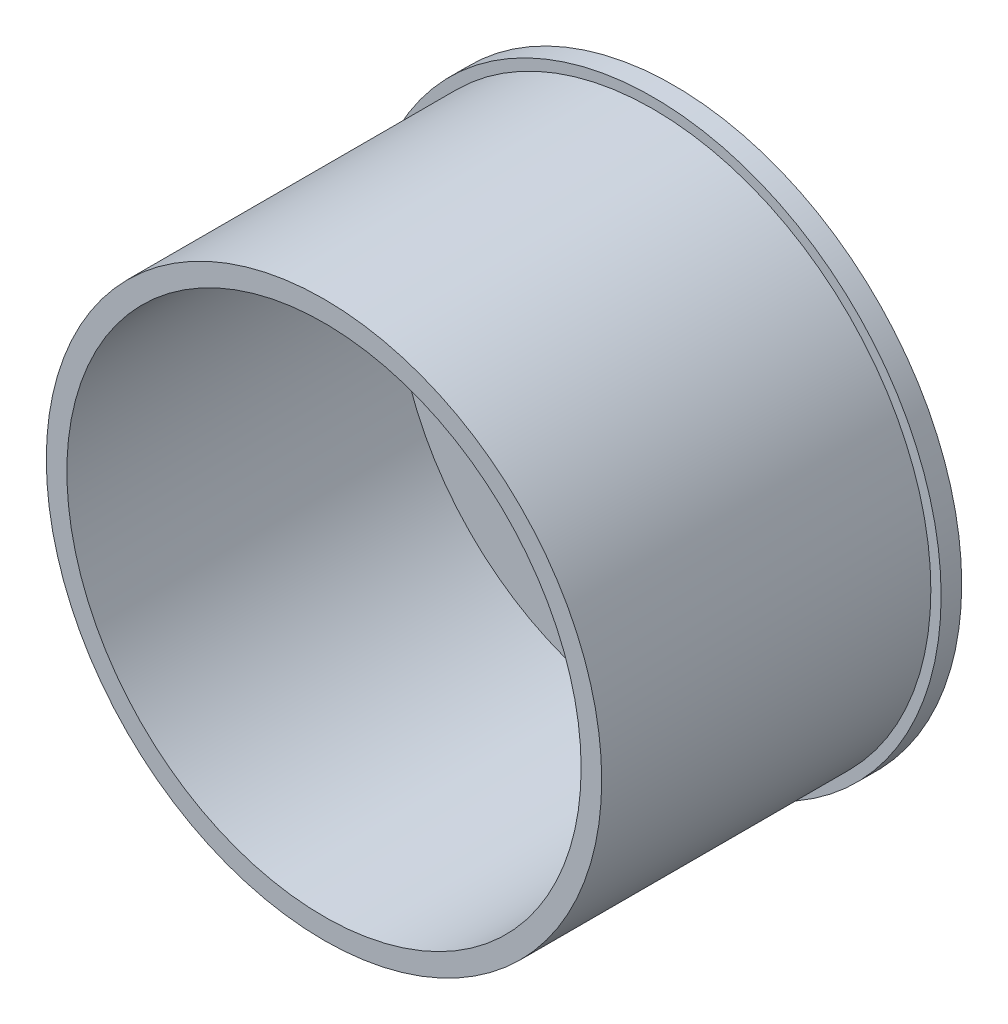
ISO-10303-21;
HEADER;
FILE_DESCRIPTION(('STEP AP214'),'2;1');
FILE_NAME('part.step','',(''),(''),'','','');
FILE_SCHEMA(('AUTOMOTIVE_DESIGN { 1 0 10303 214 1 1 1 1 }'));
ENDSEC;
DATA;
#1=APPLICATION_CONTEXT('core data for automotive mechanical design processes');
#2=APPLICATION_PROTOCOL_DEFINITION('international standard','automotive_design',2000,#1);
#3=PRODUCT_CONTEXT('',#1,'mechanical');
#4=PRODUCT('Part','Part','',(#3));
#5=PRODUCT_RELATED_PRODUCT_CATEGORY('part','',(#4));
#6=PRODUCT_DEFINITION_FORMATION('','',#4);
#7=PRODUCT_DEFINITION_CONTEXT('part definition',#1,'design');
#8=PRODUCT_DEFINITION('design','',#6,#7);
#9=PRODUCT_DEFINITION_SHAPE('','',#8);
#10=(LENGTH_UNIT() NAMED_UNIT(*) SI_UNIT(.MILLI.,.METRE.));
#11=(NAMED_UNIT(*) PLANE_ANGLE_UNIT() SI_UNIT($,.RADIAN.));
#12=(NAMED_UNIT(*) SI_UNIT($,.STERADIAN.) SOLID_ANGLE_UNIT());
#13=UNCERTAINTY_MEASURE_WITH_UNIT(LENGTH_MEASURE(1.E-05),#10,'distance_accuracy_value','');
#14=(GEOMETRIC_REPRESENTATION_CONTEXT(3) GLOBAL_UNCERTAINTY_ASSIGNED_CONTEXT((#13)) GLOBAL_UNIT_ASSIGNED_CONTEXT((#10,
#11,#12)) REPRESENTATION_CONTEXT('',''));
#15=CARTESIAN_POINT('',(0.,0.,0.));
#16=DIRECTION('',(0.,0.,1.));
#17=DIRECTION('',(1.,0.,0.));
#18=AXIS2_PLACEMENT_3D('',#15,#16,#17);
#19=CARTESIAN_POINT('',(0.,0.,6.35));
#20=DIRECTION('',(0.,0.,1.));
#21=DIRECTION('',(1.,0.,0.));
#22=AXIS2_PLACEMENT_3D('',#19,#20,#21);
#23=PLANE('',#22);
#24=CARTESIAN_POINT('',(-19.05,0.,6.35));
#25=DIRECTION('',(0.,0.,-1.));
#26=DIRECTION('',(-1.,0.,0.));
#27=AXIS2_PLACEMENT_3D('',#24,#25,#26);
#28=CIRCLE('',#27,3.302);
#29=CARTESIAN_POINT('',(-22.352,0.,6.35));
#30=VERTEX_POINT('',#29);
#31=EDGE_CURVE('E106',#30,#30,#28,.T.);
#32=ORIENTED_EDGE('',*,*,#31,.T.);
#33=EDGE_LOOP('',(#32));
#34=FACE_BOUND('',#33,.T.);
#35=CARTESIAN_POINT('',(0.0916904470477923,3.175,6.35));
#36=DIRECTION('',(0.,0.,-1.));
#37=DIRECTION('',(-1.,0.,0.));
#38=AXIS2_PLACEMENT_3D('',#35,#36,#37);
#39=CIRCLE('',#38,3.17499999999999);
#40=CARTESIAN_POINT('',(-3.08198642175041,3.26665223649931,6.35));
#41=VERTEX_POINT('',#40);
#42=CARTESIAN_POINT('',(3.26536731584596,3.0833477635007,6.35));
#43=VERTEX_POINT('',#42);
#44=EDGE_CURVE('E78',#41,#43,#39,.T.);
#45=ORIENTED_EDGE('',*,*,#44,.T.);
#46=DIRECTION('',(-0.0288668461415135,-0.999583265763209,0.));
#47=VECTOR('',#46,1.);
#48=CARTESIAN_POINT('',(3.26536731584596,3.0833477635007,6.35));
#49=LINE('',#48,#47);
#50=CARTESIAN_POINT('',(3.0819864217504,-3.2666522364993,6.35));
#51=VERTEX_POINT('',#50);
#52=EDGE_CURVE('E87',#43,#51,#49,.T.);
#53=ORIENTED_EDGE('',*,*,#52,.T.);
#54=CARTESIAN_POINT('',(-0.0916904470477946,-3.175,6.35));
#55=DIRECTION('',(0.,0.,-1.));
#56=DIRECTION('',(-1.,0.,0.));
#57=AXIS2_PLACEMENT_3D('',#54,#55,#56);
#58=CIRCLE('',#57,3.17499999999999);
#59=CARTESIAN_POINT('',(-3.26536731584596,-3.08334776350069,6.35));
#60=VERTEX_POINT('',#59);
#61=EDGE_CURVE('E50',#51,#60,#58,.T.);
#62=ORIENTED_EDGE('',*,*,#61,.T.);
#63=DIRECTION('',(0.0288668461415135,0.999583265763209,0.));
#64=VECTOR('',#63,1.);
#65=CARTESIAN_POINT('',(-3.08198642175041,3.26665223649931,6.35));
#66=LINE('',#65,#64);
#67=EDGE_CURVE('E84',#60,#41,#66,.T.);
#68=ORIENTED_EDGE('',*,*,#67,.T.);
#69=EDGE_LOOP('',(#45,#53,#62,#68));
#70=FACE_BOUND('',#69,.T.);
#71=CARTESIAN_POINT('',(0.,0.,6.34999999999999));
#72=DIRECTION('',(0.,0.,1.));
#73=DIRECTION('',(1.,0.,0.));
#74=AXIS2_PLACEMENT_3D('',#71,#72,#73);
#75=CIRCLE('',#74,79.375);
#76=CARTESIAN_POINT('',(79.375,0.,6.34999999999999));
#77=VERTEX_POINT('',#76);
#78=EDGE_CURVE('E11',#77,#77,#75,.F.);
#79=ORIENTED_EDGE('',*,*,#78,.F.);
#80=EDGE_LOOP('',(#79));
#81=FACE_BOUND('',#80,.T.);
#82=ADVANCED_FACE('F35',(#34,#70,#81),#23,.T.);
#83=CARTESIAN_POINT('',(0.,0.,6.35));
#84=DIRECTION('',(0.,0.,-1.));
#85=DIRECTION('',(-1.,0.,0.));
#86=AXIS2_PLACEMENT_3D('',#83,#84,#85);
#87=CYLINDRICAL_SURFACE('',#86,88.9);
#88=CARTESIAN_POINT('',(0.,0.,6.35));
#89=DIRECTION('',(0.,0.,1.));
#90=DIRECTION('',(1.,0.,0.));
#91=AXIS2_PLACEMENT_3D('',#88,#89,#90);
#92=CIRCLE('',#91,88.9);
#93=CARTESIAN_POINT('',(88.9,0.,6.35));
#94=VERTEX_POINT('',#93);
#95=EDGE_CURVE('E43',#94,#94,#92,.T.);
#96=ORIENTED_EDGE('',*,*,#95,.F.);
#97=EDGE_LOOP('',(#96));
#98=FACE_BOUND('',#97,.T.);
#99=CARTESIAN_POINT('',(0.,0.,0.));
#100=DIRECTION('',(0.,0.,1.));
#101=DIRECTION('',(1.,0.,0.));
#102=AXIS2_PLACEMENT_3D('',#99,#100,#101);
#103=CIRCLE('',#102,88.9);
#104=CARTESIAN_POINT('',(88.9,0.,0.));
#105=VERTEX_POINT('',#104);
#106=EDGE_CURVE('E112',#105,#105,#103,.T.);
#107=ORIENTED_EDGE('',*,*,#106,.T.);
#108=EDGE_LOOP('',(#107));
#109=FACE_BOUND('',#108,.T.);
#110=ADVANCED_FACE('F37',(#98,#109),#87,.T.);
#111=CARTESIAN_POINT('',(0.,0.,6.35));
#112=DIRECTION('',(0.,0.,1.));
#113=DIRECTION('',(1.,0.,0.));
#114=AXIS2_PLACEMENT_3D('',#111,#112,#113);
#115=CIRCLE('',#114,85.725);
#116=CARTESIAN_POINT('',(85.725,0.,6.35));
#117=VERTEX_POINT('',#116);
#118=EDGE_CURVE('E99',#117,#117,#115,.T.);
#119=ORIENTED_EDGE('',*,*,#118,.F.);
#120=EDGE_LOOP('',(#119));
#121=FACE_BOUND('',#120,.T.);
#122=ORIENTED_EDGE('',*,*,#95,.T.);
#123=EDGE_LOOP('',(#122));
#124=FACE_BOUND('',#123,.T.);
#125=ADVANCED_FACE('F130',(#121,#124),#23,.T.);
#126=CARTESIAN_POINT('',(0.,0.,0.));
#127=DIRECTION('',(0.,0.,1.));
#128=DIRECTION('',(1.,0.,0.));
#129=AXIS2_PLACEMENT_3D('',#126,#127,#128);
#130=PLANE('',#129);
#131=DIRECTION('',(-0.0288668461415135,-0.999583265763209,0.));
#132=VECTOR('',#131,1.);
#133=CARTESIAN_POINT('',(3.26536731584596,3.0833477635007,0.));
#134=LINE('',#133,#132);
#135=CARTESIAN_POINT('',(3.26536731584596,3.0833477635007,0.));
#136=VERTEX_POINT('',#135);
#137=CARTESIAN_POINT('',(3.08198642175039,-3.2666522364993,0.));
#138=VERTEX_POINT('',#137);
#139=EDGE_CURVE('E105',#136,#138,#134,.T.);
#140=ORIENTED_EDGE('',*,*,#139,.F.);
#141=CARTESIAN_POINT('',(0.0916904470477923,3.175,0.));
#142=DIRECTION('',(0.,0.,-1.));
#143=DIRECTION('',(-1.,0.,0.));
#144=AXIS2_PLACEMENT_3D('',#141,#142,#143);
#145=CIRCLE('',#144,3.17499999999999);
#146=CARTESIAN_POINT('',(-3.08198642175041,3.26665223649931,0.));
#147=VERTEX_POINT('',#146);
#148=EDGE_CURVE('E58',#147,#136,#145,.T.);
#149=ORIENTED_EDGE('',*,*,#148,.F.);
#150=DIRECTION('',(0.0288668461415135,0.999583265763209,0.));
#151=VECTOR('',#150,1.);
#152=CARTESIAN_POINT('',(-3.08198642175041,3.26665223649931,0.));
#153=LINE('',#152,#151);
#154=CARTESIAN_POINT('',(-3.26536731584596,-3.08334776350069,0.));
#155=VERTEX_POINT('',#154);
#156=EDGE_CURVE('E93',#155,#147,#153,.T.);
#157=ORIENTED_EDGE('',*,*,#156,.F.);
#158=CARTESIAN_POINT('',(-0.0916904470477946,-3.175,0.));
#159=DIRECTION('',(0.,0.,-1.));
#160=DIRECTION('',(-1.,0.,0.));
#161=AXIS2_PLACEMENT_3D('',#158,#159,#160);
#162=CIRCLE('',#161,3.17499999999999);
#163=EDGE_CURVE('E96',#138,#155,#162,.T.);
#164=ORIENTED_EDGE('',*,*,#163,.F.);
#165=EDGE_LOOP('',(#140,#149,#157,#164));
#166=FACE_BOUND('',#165,.T.);
#167=CARTESIAN_POINT('',(-19.05,0.,0.));
#168=DIRECTION('',(0.,0.,-1.));
#169=DIRECTION('',(-1.,0.,0.));
#170=AXIS2_PLACEMENT_3D('',#167,#168,#169);
#171=CIRCLE('',#170,3.302);
#172=CARTESIAN_POINT('',(-22.352,0.,0.));
#173=VERTEX_POINT('',#172);
#174=EDGE_CURVE('E118',#173,#173,#171,.T.);
#175=ORIENTED_EDGE('',*,*,#174,.F.);
#176=EDGE_LOOP('',(#175));
#177=FACE_BOUND('',#176,.T.);
#178=ORIENTED_EDGE('',*,*,#106,.F.);
#179=EDGE_LOOP('',(#178));
#180=FACE_BOUND('',#179,.T.);
#181=ADVANCED_FACE('F127',(#166,#177,#180),#130,.F.);
#182=CARTESIAN_POINT('',(-19.05,0.,6.35));
#183=DIRECTION('',(0.,0.,-1.));
#184=DIRECTION('',(-1.,0.,0.));
#185=AXIS2_PLACEMENT_3D('',#182,#183,#184);
#186=CYLINDRICAL_SURFACE('',#185,3.302);
#187=ORIENTED_EDGE('',*,*,#31,.F.);
#188=EDGE_LOOP('',(#187));
#189=FACE_BOUND('',#188,.T.);
#190=ORIENTED_EDGE('',*,*,#174,.T.);
#191=EDGE_LOOP('',(#190));
#192=FACE_BOUND('',#191,.T.);
#193=ADVANCED_FACE('F129',(#189,#192),#186,.F.);
#194=CARTESIAN_POINT('',(0.0916904470477923,3.175,6.35));
#195=DIRECTION('',(0.,0.,-1.));
#196=DIRECTION('',(-1.,0.,0.));
#197=AXIS2_PLACEMENT_3D('',#194,#195,#196);
#198=CYLINDRICAL_SURFACE('',#197,3.17499999999999);
#199=ORIENTED_EDGE('',*,*,#148,.T.);
#200=DIRECTION('',(0.,0.,-1.));
#201=VECTOR('',#200,1.);
#202=CARTESIAN_POINT('',(3.26536731584596,3.0833477635007,6.35));
#203=LINE('',#202,#201);
#204=EDGE_CURVE('E74',#43,#136,#203,.T.);
#205=ORIENTED_EDGE('',*,*,#204,.F.);
#206=ORIENTED_EDGE('',*,*,#44,.F.);
#207=DIRECTION('',(0.,0.,-1.));
#208=VECTOR('',#207,1.);
#209=CARTESIAN_POINT('',(-3.08198642175041,3.26665223649931,6.35));
#210=LINE('',#209,#208);
#211=EDGE_CURVE('E110',#41,#147,#210,.T.);
#212=ORIENTED_EDGE('',*,*,#211,.T.);
#213=EDGE_LOOP('',(#199,#205,#206,#212));
#214=FACE_BOUND('',#213,.T.);
#215=ADVANCED_FACE('F76',(#214),#198,.F.);
#216=CARTESIAN_POINT('',(-3.08198642175041,3.26665223649931,6.35));
#217=DIRECTION('',(-0.999583265763209,0.0288668461415135,0.));
#218=DIRECTION('',(-0.0288668461415135,-0.999583265763209,0.));
#219=AXIS2_PLACEMENT_3D('',#216,#217,#218);
#220=PLANE('',#219);
#221=ORIENTED_EDGE('',*,*,#156,.T.);
#222=ORIENTED_EDGE('',*,*,#211,.F.);
#223=ORIENTED_EDGE('',*,*,#67,.F.);
#224=DIRECTION('',(0.,0.,-1.));
#225=VECTOR('',#224,1.);
#226=CARTESIAN_POINT('',(-3.26536731584596,-3.08334776350069,6.35));
#227=LINE('',#226,#225);
#228=EDGE_CURVE('E113',#60,#155,#227,.T.);
#229=ORIENTED_EDGE('',*,*,#228,.T.);
#230=EDGE_LOOP('',(#221,#222,#223,#229));
#231=FACE_BOUND('',#230,.T.);
#232=ADVANCED_FACE('F150',(#231),#220,.F.);
#233=CARTESIAN_POINT('',(-0.0916904470477946,-3.175,6.35));
#234=DIRECTION('',(0.,0.,-1.));
#235=DIRECTION('',(-1.,0.,0.));
#236=AXIS2_PLACEMENT_3D('',#233,#234,#235);
#237=CYLINDRICAL_SURFACE('',#236,3.17499999999999);
#238=ORIENTED_EDGE('',*,*,#163,.T.);
#239=ORIENTED_EDGE('',*,*,#228,.F.);
#240=ORIENTED_EDGE('',*,*,#61,.F.);
#241=DIRECTION('',(0.,0.,-1.));
#242=VECTOR('',#241,1.);
#243=CARTESIAN_POINT('',(3.08198642175039,-3.2666522364993,6.35));
#244=LINE('',#243,#242);
#245=EDGE_CURVE('E83',#51,#138,#244,.T.);
#246=ORIENTED_EDGE('',*,*,#245,.T.);
#247=EDGE_LOOP('',(#238,#239,#240,#246));
#248=FACE_BOUND('',#247,.T.);
#249=ADVANCED_FACE('F154',(#248),#237,.F.);
#250=CARTESIAN_POINT('',(3.26536731584596,3.0833477635007,6.35));
#251=DIRECTION('',(0.999583265763209,-0.0288668461415135,0.));
#252=DIRECTION('',(0.0288668461415135,0.999583265763209,0.));
#253=AXIS2_PLACEMENT_3D('',#250,#251,#252);
#254=PLANE('',#253);
#255=ORIENTED_EDGE('',*,*,#139,.T.);
#256=ORIENTED_EDGE('',*,*,#245,.F.);
#257=ORIENTED_EDGE('',*,*,#52,.F.);
#258=ORIENTED_EDGE('',*,*,#204,.T.);
#259=EDGE_LOOP('',(#255,#256,#257,#258));
#260=FACE_BOUND('',#259,.T.);
#261=ADVANCED_FACE('F88',(#260),#254,.F.);
#262=CARTESIAN_POINT('',(0.,0.,107.95));
#263=DIRECTION('',(0.,0.,1.));
#264=DIRECTION('',(1.,0.,0.));
#265=AXIS2_PLACEMENT_3D('',#262,#263,#264);
#266=PLANE('',#265);
#267=CARTESIAN_POINT('',(0.,0.,107.95));
#268=DIRECTION('',(0.,0.,1.));
#269=DIRECTION('',(1.,0.,0.));
#270=AXIS2_PLACEMENT_3D('',#267,#268,#269);
#271=CIRCLE('',#270,85.725);
#272=CARTESIAN_POINT('',(85.725,0.,107.95));
#273=VERTEX_POINT('',#272);
#274=EDGE_CURVE('E121',#273,#273,#271,.T.);
#275=ORIENTED_EDGE('',*,*,#274,.T.);
#276=EDGE_LOOP('',(#275));
#277=FACE_BOUND('',#276,.T.);
#278=CARTESIAN_POINT('',(0.,0.,107.95));
#279=DIRECTION('',(0.,0.,1.));
#280=DIRECTION('',(1.,0.,0.));
#281=AXIS2_PLACEMENT_3D('',#278,#279,#280);
#282=CIRCLE('',#281,79.375);
#283=CARTESIAN_POINT('',(79.375,0.,107.95));
#284=VERTEX_POINT('',#283);
#285=EDGE_CURVE('E175',#284,#284,#282,.T.);
#286=ORIENTED_EDGE('',*,*,#285,.F.);
#287=EDGE_LOOP('',(#286));
#288=FACE_BOUND('',#287,.T.);
#289=ADVANCED_FACE('F153',(#277,#288),#266,.T.);
#290=CARTESIAN_POINT('',(0.,0.,107.95));
#291=DIRECTION('',(0.,0.,-1.));
#292=DIRECTION('',(-1.,0.,0.));
#293=AXIS2_PLACEMENT_3D('',#290,#291,#292);
#294=CYLINDRICAL_SURFACE('',#293,85.725);
#295=ORIENTED_EDGE('',*,*,#274,.F.);
#296=EDGE_LOOP('',(#295));
#297=FACE_BOUND('',#296,.T.);
#298=ORIENTED_EDGE('',*,*,#118,.T.);
#299=EDGE_LOOP('',(#298));
#300=FACE_BOUND('',#299,.T.);
#301=ADVANCED_FACE('F160',(#297,#300),#294,.T.);
#302=CARTESIAN_POINT('',(0.,0.,107.95));
#303=DIRECTION('',(0.,0.,-1.));
#304=DIRECTION('',(-1.,0.,0.));
#305=AXIS2_PLACEMENT_3D('',#302,#303,#304);
#306=CYLINDRICAL_SURFACE('',#305,79.375);
#307=ORIENTED_EDGE('',*,*,#285,.T.);
#308=EDGE_LOOP('',(#307));
#309=FACE_BOUND('',#308,.T.);
#310=ORIENTED_EDGE('',*,*,#78,.T.);
#311=EDGE_LOOP('',(#310));
#312=FACE_BOUND('',#311,.T.);
#313=ADVANCED_FACE('F163',(#309,#312),#306,.F.);
#314=CLOSED_SHELL('',(#82,#110,#125,#181,#193,#215,#232,#249,#261,#289,#301,#313));
#315=MANIFOLD_SOLID_BREP('B2',#314);
#316=ADVANCED_BREP_SHAPE_REPRESENTATION('',(#18,#315),#14);
#317=SHAPE_DEFINITION_REPRESENTATION(#9,#316);
ENDSEC;
END-ISO-10303-21;
